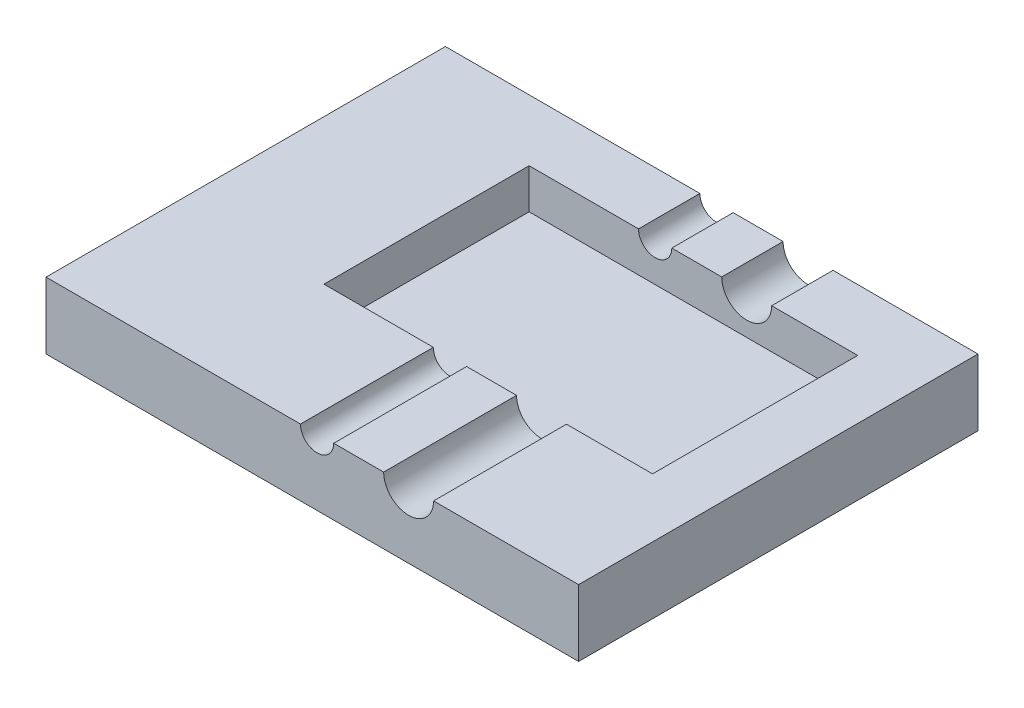
ISO-10303-21;
HEADER;
FILE_DESCRIPTION(('STEP AP214'),'2;1');
FILE_NAME('part.step','',(''),(''),'','','');
FILE_SCHEMA(('AUTOMOTIVE_DESIGN { 1 0 10303 214 1 1 1 1 }'));
ENDSEC;
DATA;
#1=APPLICATION_CONTEXT('core data for automotive mechanical design processes');
#2=APPLICATION_PROTOCOL_DEFINITION('international standard','automotive_design',2000,#1);
#3=PRODUCT_CONTEXT('',#1,'mechanical');
#4=PRODUCT('Part','Part','',(#3));
#5=PRODUCT_RELATED_PRODUCT_CATEGORY('part','',(#4));
#6=PRODUCT_DEFINITION_FORMATION('','',#4);
#7=PRODUCT_DEFINITION_CONTEXT('part definition',#1,'design');
#8=PRODUCT_DEFINITION('design','',#6,#7);
#9=PRODUCT_DEFINITION_SHAPE('','',#8);
#10=(LENGTH_UNIT() NAMED_UNIT(*) SI_UNIT(.MILLI.,.METRE.));
#11=(NAMED_UNIT(*) PLANE_ANGLE_UNIT() SI_UNIT($,.RADIAN.));
#12=(NAMED_UNIT(*) SI_UNIT($,.STERADIAN.) SOLID_ANGLE_UNIT());
#13=UNCERTAINTY_MEASURE_WITH_UNIT(LENGTH_MEASURE(1.E-05),#10,'distance_accuracy_value','');
#14=(GEOMETRIC_REPRESENTATION_CONTEXT(3) GLOBAL_UNCERTAINTY_ASSIGNED_CONTEXT((#13)) GLOBAL_UNIT_ASSIGNED_CONTEXT((#10,
#11,#12)) REPRESENTATION_CONTEXT('',''));
#15=CARTESIAN_POINT('',(0.,0.,0.));
#16=DIRECTION('',(0.,0.,1.));
#17=DIRECTION('',(1.,0.,0.));
#18=AXIS2_PLACEMENT_3D('',#15,#16,#17);
#19=CARTESIAN_POINT('',(0.,12.7,0.));
#20=DIRECTION('',(0.,-1.,0.));
#21=DIRECTION('',(0.,0.,-1.));
#22=AXIS2_PLACEMENT_3D('',#19,#20,#21);
#23=PLANE('',#22);
#24=DIRECTION('',(1.,0.,0.));
#25=VECTOR('',#24,1.);
#26=CARTESIAN_POINT('',(-23.1249939003562,12.7,-17.3143065832297));
#27=LINE('',#26,#25);
#28=CARTESIAN_POINT('',(4.09208018547385,12.7,-17.3143065832297));
#29=VERTEX_POINT('',#28);
#30=CARTESIAN_POINT('',(13.6170801854738,12.7,-17.3143065832297));
#31=VERTEX_POINT('',#30);
#32=EDGE_CURVE('E230',#29,#31,#27,.T.);
#33=ORIENTED_EDGE('',*,*,#32,.F.);
#34=DIRECTION('',(0.,0.,1.));
#35=VECTOR('',#34,1.);
#36=CARTESIAN_POINT('',(4.09208018547384,12.7,-68.1620253164557));
#37=LINE('',#36,#35);
#38=CARTESIAN_POINT('',(4.09208018547385,12.7,8.03797468354433));
#39=VERTEX_POINT('',#38);
#40=EDGE_CURVE('E257',#29,#39,#37,.T.);
#41=ORIENTED_EDGE('',*,*,#40,.T.);
#42=DIRECTION('',(1.,0.,0.));
#43=VECTOR('',#42,1.);
#44=CARTESIAN_POINT('',(-50.8,12.7,8.03797468354433));
#45=LINE('',#44,#43);
#46=CARTESIAN_POINT('',(13.6170801854738,12.7,8.03797468354433));
#47=VERTEX_POINT('',#46);
#48=EDGE_CURVE('E351',#39,#47,#45,.T.);
#49=ORIENTED_EDGE('',*,*,#48,.T.);
#50=DIRECTION('',(0.,0.,1.));
#51=VECTOR('',#50,1.);
#52=CARTESIAN_POINT('',(13.6170801854738,12.7,-68.1620253164557));
#53=LINE('',#52,#51);
#54=EDGE_CURVE('E271',#47,#31,#53,.F.);
#55=ORIENTED_EDGE('',*,*,#54,.T.);
#56=EDGE_LOOP('',(#33,#41,#49,#55));
#57=FACE_BOUND('',#56,.T.);
#58=ADVANCED_FACE('F44',(#57),#23,.F.);
#59=DIRECTION('',(-1.,0.,0.));
#60=VECTOR('',#59,1.);
#61=CARTESIAN_POINT('',(-50.8,12.7,-68.1620253164557));
#62=LINE('',#61,#60);
#63=CARTESIAN_POINT('',(13.6170801854738,12.7,-68.1620253164557));
#64=VERTEX_POINT('',#63);
#65=CARTESIAN_POINT('',(4.09208018547385,12.7,-68.1620253164557));
#66=VERTEX_POINT('',#65);
#67=EDGE_CURVE('E180',#64,#66,#62,.T.);
#68=ORIENTED_EDGE('',*,*,#67,.T.);
#69=CARTESIAN_POINT('',(4.09208018547385,12.7,-56.452963685655));
#70=VERTEX_POINT('',#69);
#71=EDGE_CURVE('E242',#66,#70,#37,.T.);
#72=ORIENTED_EDGE('',*,*,#71,.T.);
#73=DIRECTION('',(1.,0.,0.));
#74=VECTOR('',#73,1.);
#75=CARTESIAN_POINT('',(-23.1249939003562,12.7,-56.452963685655));
#76=LINE('',#75,#74);
#77=CARTESIAN_POINT('',(13.6170801854738,12.7,-56.452963685655));
#78=VERTEX_POINT('',#77);
#79=EDGE_CURVE('E240',#70,#78,#76,.T.);
#80=ORIENTED_EDGE('',*,*,#79,.T.);
#81=EDGE_CURVE('E61',#78,#64,#53,.F.);
#82=ORIENTED_EDGE('',*,*,#81,.T.);
#83=EDGE_LOOP('',(#68,#72,#80,#82));
#84=FACE_BOUND('',#83,.T.);
#85=ADVANCED_FACE('F283',(#84),#23,.F.);
#86=CARTESIAN_POINT('',(50.8,12.7,-68.1620253164557));
#87=VERTEX_POINT('',#86);
#88=CARTESIAN_POINT('',(23.1420801854738,12.7,-68.1620253164557));
#89=VERTEX_POINT('',#88);
#90=EDGE_CURVE('E173',#87,#89,#62,.T.);
#91=ORIENTED_EDGE('',*,*,#90,.T.);
#92=DIRECTION('',(0.,0.,1.));
#93=VECTOR('',#92,1.);
#94=CARTESIAN_POINT('',(23.1420801854738,12.7,-68.1620253164557));
#95=LINE('',#94,#93);
#96=CARTESIAN_POINT('',(23.1420801854738,12.7,-56.452963685655));
#97=VERTEX_POINT('',#96);
#98=EDGE_CURVE('E160',#89,#97,#95,.T.);
#99=ORIENTED_EDGE('',*,*,#98,.T.);
#100=CARTESIAN_POINT('',(39.5600692919533,12.7,-56.452963685655));
#101=VERTEX_POINT('',#100);
#102=EDGE_CURVE('E236',#97,#101,#76,.T.);
#103=ORIENTED_EDGE('',*,*,#102,.T.);
#104=DIRECTION('',(0.,0.,-1.));
#105=VECTOR('',#104,1.);
#106=CARTESIAN_POINT('',(39.5600692919533,12.7,-17.3143065832297));
#107=LINE('',#106,#105);
#108=CARTESIAN_POINT('',(39.5600692919533,12.7,-17.3143065832297));
#109=VERTEX_POINT('',#108);
#110=EDGE_CURVE('E228',#109,#101,#107,.T.);
#111=ORIENTED_EDGE('',*,*,#110,.F.);
#112=CARTESIAN_POINT('',(23.1420801854738,12.7,-17.3143065832297));
#113=VERTEX_POINT('',#112);
#114=EDGE_CURVE('E227',#113,#109,#27,.T.);
#115=ORIENTED_EDGE('',*,*,#114,.F.);
#116=CARTESIAN_POINT('',(23.1420801854738,12.7,8.03797468354433));
#117=VERTEX_POINT('',#116);
#118=EDGE_CURVE('E169',#113,#117,#95,.T.);
#119=ORIENTED_EDGE('',*,*,#118,.T.);
#120=CARTESIAN_POINT('',(50.8,12.7,8.03797468354433));
#121=VERTEX_POINT('',#120);
#122=EDGE_CURVE('E191',#117,#121,#45,.T.);
#123=ORIENTED_EDGE('',*,*,#122,.T.);
#124=DIRECTION('',(0.,0.,-1.));
#125=VECTOR('',#124,1.);
#126=CARTESIAN_POINT('',(50.8,12.7,8.03797468354433));
#127=LINE('',#126,#125);
#128=EDGE_CURVE('E184',#121,#87,#127,.T.);
#129=ORIENTED_EDGE('',*,*,#128,.T.);
#130=EDGE_LOOP('',(#91,#99,#103,#111,#115,#119,#123,#129));
#131=FACE_BOUND('',#130,.T.);
#132=ADVANCED_FACE('F185',(#131),#23,.F.);
#133=CARTESIAN_POINT('',(-50.8,12.7,8.03797468354433));
#134=DIRECTION('',(0.,0.,-1.));
#135=DIRECTION('',(-1.,0.,0.));
#136=AXIS2_PLACEMENT_3D('',#133,#134,#135);
#137=PLANE('',#136);
#138=CARTESIAN_POINT('',(0.917080185473845,12.7,8.03797468354433));
#139=DIRECTION('',(0.,0.,1.));
#140=DIRECTION('',(1.,0.,0.));
#141=AXIS2_PLACEMENT_3D('',#138,#139,#140);
#142=CIRCLE('',#141,3.175);
#143=CARTESIAN_POINT('',(-2.25791981452615,12.7,8.03797468354433));
#144=VERTEX_POINT('',#143);
#145=EDGE_CURVE('E279',#144,#39,#142,.T.);
#146=ORIENTED_EDGE('',*,*,#145,.F.);
#147=CARTESIAN_POINT('',(-50.8,12.7,8.03797468354433));
#148=VERTEX_POINT('',#147);
#149=EDGE_CURVE('E314',#148,#144,#45,.T.);
#150=ORIENTED_EDGE('',*,*,#149,.F.);
#151=DIRECTION('',(0.,-1.,0.));
#152=VECTOR('',#151,1.);
#153=CARTESIAN_POINT('',(-50.8,12.7,8.03797468354433));
#154=LINE('',#153,#152);
#155=CARTESIAN_POINT('',(-50.8,0.,8.03797468354433));
#156=VERTEX_POINT('',#155);
#157=EDGE_CURVE('E311',#148,#156,#154,.T.);
#158=ORIENTED_EDGE('',*,*,#157,.T.);
#159=DIRECTION('',(1.,0.,0.));
#160=VECTOR('',#159,1.);
#161=CARTESIAN_POINT('',(-50.8,0.,8.03797468354433));
#162=LINE('',#161,#160);
#163=CARTESIAN_POINT('',(50.8,0.,8.03797468354433));
#164=VERTEX_POINT('',#163);
#165=EDGE_CURVE('E200',#156,#164,#162,.T.);
#166=ORIENTED_EDGE('',*,*,#165,.T.);
#167=DIRECTION('',(0.,-1.,0.));
#168=VECTOR('',#167,1.);
#169=CARTESIAN_POINT('',(50.8,12.7,8.03797468354433));
#170=LINE('',#169,#168);
#171=EDGE_CURVE('E310',#121,#164,#170,.T.);
#172=ORIENTED_EDGE('',*,*,#171,.F.);
#173=ORIENTED_EDGE('',*,*,#122,.F.);
#174=CARTESIAN_POINT('',(18.3795801854738,12.7,8.03797468354433));
#175=DIRECTION('',(0.,0.,1.));
#176=DIRECTION('',(1.,0.,0.));
#177=AXIS2_PLACEMENT_3D('',#174,#175,#176);
#178=CIRCLE('',#177,4.7625);
#179=EDGE_CURVE('E177',#47,#117,#178,.T.);
#180=ORIENTED_EDGE('',*,*,#179,.F.);
#181=ORIENTED_EDGE('',*,*,#48,.F.);
#182=EDGE_LOOP('',(#146,#150,#158,#166,#172,#173,#180,#181));
#183=FACE_BOUND('',#182,.T.);
#184=ADVANCED_FACE('F359',(#183),#137,.F.);
#185=ORIENTED_EDGE('',*,*,#149,.T.);
#186=DIRECTION('',(0.,0.,1.));
#187=VECTOR('',#186,1.);
#188=CARTESIAN_POINT('',(-2.25791981452615,12.7,-68.1620253164557));
#189=LINE('',#188,#187);
#190=CARTESIAN_POINT('',(-2.25791981452615,12.7,-17.3143065832297));
#191=VERTEX_POINT('',#190);
#192=EDGE_CURVE('E167',#144,#191,#189,.F.);
#193=ORIENTED_EDGE('',*,*,#192,.T.);
#194=CARTESIAN_POINT('',(-23.1249939003562,12.7,-17.3143065832297));
#195=VERTEX_POINT('',#194);
#196=EDGE_CURVE('E225',#195,#191,#27,.T.);
#197=ORIENTED_EDGE('',*,*,#196,.F.);
#198=DIRECTION('',(0.,0.,-1.));
#199=VECTOR('',#198,1.);
#200=CARTESIAN_POINT('',(-23.1249939003562,12.7,-17.3143065832297));
#201=LINE('',#200,#199);
#202=CARTESIAN_POINT('',(-23.1249939003562,12.7,-56.452963685655));
#203=VERTEX_POINT('',#202);
#204=EDGE_CURVE('E239',#195,#203,#201,.T.);
#205=ORIENTED_EDGE('',*,*,#204,.T.);
#206=CARTESIAN_POINT('',(-2.25791981452615,12.7,-56.452963685655));
#207=VERTEX_POINT('',#206);
#208=EDGE_CURVE('E235',#203,#207,#76,.T.);
#209=ORIENTED_EDGE('',*,*,#208,.T.);
#210=CARTESIAN_POINT('',(-2.25791981452615,12.7,-68.1620253164557));
#211=VERTEX_POINT('',#210);
#212=EDGE_CURVE('E68',#207,#211,#189,.F.);
#213=ORIENTED_EDGE('',*,*,#212,.T.);
#214=CARTESIAN_POINT('',(-50.8,12.7,-68.1620253164557));
#215=VERTEX_POINT('',#214);
#216=EDGE_CURVE('E188',#211,#215,#62,.T.);
#217=ORIENTED_EDGE('',*,*,#216,.T.);
#218=DIRECTION('',(0.,0.,1.));
#219=VECTOR('',#218,1.);
#220=CARTESIAN_POINT('',(-50.8,12.7,8.03797468354433));
#221=LINE('',#220,#219);
#222=EDGE_CURVE('E190',#215,#148,#221,.T.);
#223=ORIENTED_EDGE('',*,*,#222,.T.);
#224=EDGE_LOOP('',(#185,#193,#197,#205,#209,#213,#217,#223));
#225=FACE_BOUND('',#224,.T.);
#226=ADVANCED_FACE('F347',(#225),#23,.F.);
#227=CARTESIAN_POINT('',(50.8,12.7,8.03797468354433));
#228=DIRECTION('',(-1.,0.,0.));
#229=DIRECTION('',(0.,0.,1.));
#230=AXIS2_PLACEMENT_3D('',#227,#228,#229);
#231=PLANE('',#230);
#232=DIRECTION('',(0.,0.,-1.));
#233=VECTOR('',#232,1.);
#234=CARTESIAN_POINT('',(50.8,0.,8.03797468354433));
#235=LINE('',#234,#233);
#236=CARTESIAN_POINT('',(50.8,0.,-68.1620253164557));
#237=VERTEX_POINT('',#236);
#238=EDGE_CURVE('E208',#164,#237,#235,.T.);
#239=ORIENTED_EDGE('',*,*,#238,.T.);
#240=DIRECTION('',(0.,-1.,0.));
#241=VECTOR('',#240,1.);
#242=CARTESIAN_POINT('',(50.8,12.7,-68.1620253164557));
#243=LINE('',#242,#241);
#244=EDGE_CURVE('E319',#87,#237,#243,.T.);
#245=ORIENTED_EDGE('',*,*,#244,.F.);
#246=ORIENTED_EDGE('',*,*,#128,.F.);
#247=ORIENTED_EDGE('',*,*,#171,.T.);
#248=EDGE_LOOP('',(#239,#245,#246,#247));
#249=FACE_BOUND('',#248,.T.);
#250=ADVANCED_FACE('F50',(#249),#231,.F.);
#251=CARTESIAN_POINT('',(-50.8,12.7,-68.1620253164557));
#252=DIRECTION('',(0.,0.,1.));
#253=DIRECTION('',(1.,0.,0.));
#254=AXIS2_PLACEMENT_3D('',#251,#252,#253);
#255=PLANE('',#254);
#256=ORIENTED_EDGE('',*,*,#216,.F.);
#257=CARTESIAN_POINT('',(0.917080185473845,12.7,-68.1620253164557));
#258=DIRECTION('',(0.,0.,1.));
#259=DIRECTION('',(1.,0.,0.));
#260=AXIS2_PLACEMENT_3D('',#257,#258,#259);
#261=CIRCLE('',#260,3.175);
#262=EDGE_CURVE('E273',#211,#66,#261,.T.);
#263=ORIENTED_EDGE('',*,*,#262,.T.);
#264=ORIENTED_EDGE('',*,*,#67,.F.);
#265=CARTESIAN_POINT('',(18.3795801854738,12.7,-68.1620253164557));
#266=DIRECTION('',(0.,0.,1.));
#267=DIRECTION('',(1.,0.,0.));
#268=AXIS2_PLACEMENT_3D('',#265,#266,#267);
#269=CIRCLE('',#268,4.7625);
#270=EDGE_CURVE('E159',#64,#89,#269,.T.);
#271=ORIENTED_EDGE('',*,*,#270,.T.);
#272=ORIENTED_EDGE('',*,*,#90,.F.);
#273=ORIENTED_EDGE('',*,*,#244,.T.);
#274=DIRECTION('',(-1.,0.,0.));
#275=VECTOR('',#274,1.);
#276=CARTESIAN_POINT('',(-50.8,0.,-68.1620253164557));
#277=LINE('',#276,#275);
#278=CARTESIAN_POINT('',(-50.8,0.,-68.1620253164557));
#279=VERTEX_POINT('',#278);
#280=EDGE_CURVE('E297',#237,#279,#277,.T.);
#281=ORIENTED_EDGE('',*,*,#280,.T.);
#282=DIRECTION('',(0.,-1.,0.));
#283=VECTOR('',#282,1.);
#284=CARTESIAN_POINT('',(-50.8,12.7,-68.1620253164557));
#285=LINE('',#284,#283);
#286=EDGE_CURVE('E320',#215,#279,#285,.T.);
#287=ORIENTED_EDGE('',*,*,#286,.F.);
#288=EDGE_LOOP('',(#256,#263,#264,#271,#272,#273,#281,#287));
#289=FACE_BOUND('',#288,.T.);
#290=ADVANCED_FACE('F175',(#289),#255,.F.);
#291=CARTESIAN_POINT('',(-50.8,12.7,8.03797468354433));
#292=DIRECTION('',(1.,0.,0.));
#293=DIRECTION('',(0.,0.,-1.));
#294=AXIS2_PLACEMENT_3D('',#291,#292,#293);
#295=PLANE('',#294);
#296=DIRECTION('',(0.,0.,1.));
#297=VECTOR('',#296,1.);
#298=CARTESIAN_POINT('',(-50.8,0.,8.03797468354433));
#299=LINE('',#298,#297);
#300=EDGE_CURVE('E203',#279,#156,#299,.T.);
#301=ORIENTED_EDGE('',*,*,#300,.T.);
#302=ORIENTED_EDGE('',*,*,#157,.F.);
#303=ORIENTED_EDGE('',*,*,#222,.F.);
#304=ORIENTED_EDGE('',*,*,#286,.T.);
#305=EDGE_LOOP('',(#301,#302,#303,#304));
#306=FACE_BOUND('',#305,.T.);
#307=ADVANCED_FACE('F453',(#306),#295,.F.);
#308=CARTESIAN_POINT('',(0.,0.,0.));
#309=DIRECTION('',(0.,-1.,0.));
#310=DIRECTION('',(0.,0.,-1.));
#311=AXIS2_PLACEMENT_3D('',#308,#309,#310);
#312=PLANE('',#311);
#313=ORIENTED_EDGE('',*,*,#238,.F.);
#314=ORIENTED_EDGE('',*,*,#165,.F.);
#315=ORIENTED_EDGE('',*,*,#300,.F.);
#316=ORIENTED_EDGE('',*,*,#280,.F.);
#317=EDGE_LOOP('',(#313,#314,#315,#316));
#318=FACE_BOUND('',#317,.T.);
#319=ADVANCED_FACE('F445',(#318),#312,.T.);
#320=CARTESIAN_POINT('',(-23.1249939003562,5.08,-17.3143065832297));
#321=DIRECTION('',(1.,0.,0.));
#322=DIRECTION('',(0.,0.,-1.));
#323=AXIS2_PLACEMENT_3D('',#320,#321,#322);
#324=PLANE('',#323);
#325=ORIENTED_EDGE('',*,*,#204,.F.);
#326=DIRECTION('',(0.,1.,0.));
#327=VECTOR('',#326,1.);
#328=CARTESIAN_POINT('',(-23.1249939003562,5.08,-17.3143065832297));
#329=LINE('',#328,#327);
#330=CARTESIAN_POINT('',(-23.1249939003562,5.08,-17.3143065832297));
#331=VERTEX_POINT('',#330);
#332=EDGE_CURVE('E220',#331,#195,#329,.T.);
#333=ORIENTED_EDGE('',*,*,#332,.F.);
#334=DIRECTION('',(0.,0.,-1.));
#335=VECTOR('',#334,1.);
#336=CARTESIAN_POINT('',(-23.1249939003562,5.08,-17.3143065832297));
#337=LINE('',#336,#335);
#338=CARTESIAN_POINT('',(-23.1249939003562,5.08,-56.452963685655));
#339=VERTEX_POINT('',#338);
#340=EDGE_CURVE('E226',#331,#339,#337,.T.);
#341=ORIENTED_EDGE('',*,*,#340,.T.);
#342=DIRECTION('',(0.,1.,0.));
#343=VECTOR('',#342,1.);
#344=CARTESIAN_POINT('',(-23.1249939003562,5.08,-56.452963685655));
#345=LINE('',#344,#343);
#346=EDGE_CURVE('E204',#339,#203,#345,.T.);
#347=ORIENTED_EDGE('',*,*,#346,.T.);
#348=EDGE_LOOP('',(#325,#333,#341,#347));
#349=FACE_BOUND('',#348,.T.);
#350=ADVANCED_FACE('F341',(#349),#324,.T.);
#351=CARTESIAN_POINT('',(-23.1249939003562,5.08,-56.452963685655));
#352=DIRECTION('',(0.,0.,1.));
#353=DIRECTION('',(1.,0.,0.));
#354=AXIS2_PLACEMENT_3D('',#351,#352,#353);
#355=PLANE('',#354);
#356=CARTESIAN_POINT('',(0.917080185473845,12.7,-56.452963685655));
#357=DIRECTION('',(0.,0.,1.));
#358=DIRECTION('',(1.,0.,0.));
#359=AXIS2_PLACEMENT_3D('',#356,#357,#358);
#360=CIRCLE('',#359,3.175);
#361=EDGE_CURVE('E260',#207,#70,#360,.T.);
#362=ORIENTED_EDGE('',*,*,#361,.F.);
#363=ORIENTED_EDGE('',*,*,#208,.F.);
#364=ORIENTED_EDGE('',*,*,#346,.F.);
#365=DIRECTION('',(1.,0.,0.));
#366=VECTOR('',#365,1.);
#367=CARTESIAN_POINT('',(-23.1249939003562,5.08,-56.452963685655));
#368=LINE('',#367,#366);
#369=CARTESIAN_POINT('',(39.5600692919533,5.08,-56.452963685655));
#370=VERTEX_POINT('',#369);
#371=EDGE_CURVE('E253',#339,#370,#368,.T.);
#372=ORIENTED_EDGE('',*,*,#371,.T.);
#373=DIRECTION('',(0.,1.,0.));
#374=VECTOR('',#373,1.);
#375=CARTESIAN_POINT('',(39.5600692919533,5.08,-56.452963685655));
#376=LINE('',#375,#374);
#377=EDGE_CURVE('E207',#370,#101,#376,.T.);
#378=ORIENTED_EDGE('',*,*,#377,.T.);
#379=ORIENTED_EDGE('',*,*,#102,.F.);
#380=CARTESIAN_POINT('',(18.3795801854738,12.7,-56.452963685655));
#381=DIRECTION('',(0.,0.,1.));
#382=DIRECTION('',(1.,0.,0.));
#383=AXIS2_PLACEMENT_3D('',#380,#381,#382);
#384=CIRCLE('',#383,4.7625);
#385=EDGE_CURVE('E161',#78,#97,#384,.T.);
#386=ORIENTED_EDGE('',*,*,#385,.F.);
#387=ORIENTED_EDGE('',*,*,#79,.F.);
#388=EDGE_LOOP('',(#362,#363,#364,#372,#378,#379,#386,#387));
#389=FACE_BOUND('',#388,.T.);
#390=ADVANCED_FACE('F343',(#389),#355,.T.);
#391=CARTESIAN_POINT('',(39.5600692919533,5.08,-17.3143065832297));
#392=DIRECTION('',(1.,0.,0.));
#393=DIRECTION('',(0.,0.,-1.));
#394=AXIS2_PLACEMENT_3D('',#391,#392,#393);
#395=PLANE('',#394);
#396=ORIENTED_EDGE('',*,*,#110,.T.);
#397=ORIENTED_EDGE('',*,*,#377,.F.);
#398=DIRECTION('',(0.,0.,-1.));
#399=VECTOR('',#398,1.);
#400=CARTESIAN_POINT('',(39.5600692919533,5.08,-17.3143065832297));
#401=LINE('',#400,#399);
#402=CARTESIAN_POINT('',(39.5600692919533,5.08,-17.3143065832297));
#403=VERTEX_POINT('',#402);
#404=EDGE_CURVE('E246',#403,#370,#401,.T.);
#405=ORIENTED_EDGE('',*,*,#404,.F.);
#406=DIRECTION('',(0.,1.,0.));
#407=VECTOR('',#406,1.);
#408=CARTESIAN_POINT('',(39.5600692919533,5.08,-17.3143065832297));
#409=LINE('',#408,#407);
#410=EDGE_CURVE('E213',#403,#109,#409,.T.);
#411=ORIENTED_EDGE('',*,*,#410,.T.);
#412=EDGE_LOOP('',(#396,#397,#405,#411));
#413=FACE_BOUND('',#412,.T.);
#414=ADVANCED_FACE('F334',(#413),#395,.F.);
#415=CARTESIAN_POINT('',(-23.1249939003562,5.08,-17.3143065832297));
#416=DIRECTION('',(0.,0.,1.));
#417=DIRECTION('',(1.,0.,0.));
#418=AXIS2_PLACEMENT_3D('',#415,#416,#417);
#419=PLANE('',#418);
#420=ORIENTED_EDGE('',*,*,#196,.T.);
#421=CARTESIAN_POINT('',(0.917080185473845,12.7,-17.3143065832297));
#422=DIRECTION('',(0.,0.,1.));
#423=DIRECTION('',(1.,0.,0.));
#424=AXIS2_PLACEMENT_3D('',#421,#422,#423);
#425=CIRCLE('',#424,3.175);
#426=EDGE_CURVE('E11',#191,#29,#425,.T.);
#427=ORIENTED_EDGE('',*,*,#426,.T.);
#428=ORIENTED_EDGE('',*,*,#32,.T.);
#429=CARTESIAN_POINT('',(18.3795801854738,12.7,-17.3143065832297));
#430=DIRECTION('',(0.,0.,1.));
#431=DIRECTION('',(1.,0.,0.));
#432=AXIS2_PLACEMENT_3D('',#429,#430,#431);
#433=CIRCLE('',#432,4.7625);
#434=EDGE_CURVE('E53',#31,#113,#433,.T.);
#435=ORIENTED_EDGE('',*,*,#434,.T.);
#436=ORIENTED_EDGE('',*,*,#114,.T.);
#437=ORIENTED_EDGE('',*,*,#410,.F.);
#438=DIRECTION('',(1.,0.,0.));
#439=VECTOR('',#438,1.);
#440=CARTESIAN_POINT('',(-23.1249939003562,5.08,-17.3143065832297));
#441=LINE('',#440,#439);
#442=EDGE_CURVE('E222',#331,#403,#441,.T.);
#443=ORIENTED_EDGE('',*,*,#442,.F.);
#444=ORIENTED_EDGE('',*,*,#332,.T.);
#445=EDGE_LOOP('',(#420,#427,#428,#435,#436,#437,#443,#444));
#446=FACE_BOUND('',#445,.T.);
#447=ADVANCED_FACE('F326',(#446),#419,.F.);
#448=CARTESIAN_POINT('',(0.,5.08,0.));
#449=DIRECTION('',(0.,-1.,0.));
#450=DIRECTION('',(0.,0.,-1.));
#451=AXIS2_PLACEMENT_3D('',#448,#449,#450);
#452=PLANE('',#451);
#453=ORIENTED_EDGE('',*,*,#340,.F.);
#454=ORIENTED_EDGE('',*,*,#442,.T.);
#455=ORIENTED_EDGE('',*,*,#404,.T.);
#456=ORIENTED_EDGE('',*,*,#371,.F.);
#457=EDGE_LOOP('',(#453,#454,#455,#456));
#458=FACE_BOUND('',#457,.T.);
#459=ADVANCED_FACE('F338',(#458),#452,.F.);
#460=CARTESIAN_POINT('',(18.3795801854738,12.7,-68.1620253164557));
#461=DIRECTION('',(0.,0.,1.));
#462=DIRECTION('',(1.,0.,0.));
#463=AXIS2_PLACEMENT_3D('',#460,#461,#462);
#464=CYLINDRICAL_SURFACE('',#463,4.7625);
#465=ORIENTED_EDGE('',*,*,#434,.F.);
#466=ORIENTED_EDGE('',*,*,#54,.F.);
#467=ORIENTED_EDGE('',*,*,#179,.T.);
#468=ORIENTED_EDGE('',*,*,#118,.F.);
#469=EDGE_LOOP('',(#465,#466,#467,#468));
#470=FACE_BOUND('',#469,.T.);
#471=ADVANCED_FACE('F352',(#470),#464,.F.);
#472=CARTESIAN_POINT('',(0.917080185473845,12.7,-68.1620253164557));
#473=DIRECTION('',(0.,0.,1.));
#474=DIRECTION('',(1.,0.,0.));
#475=AXIS2_PLACEMENT_3D('',#472,#473,#474);
#476=CYLINDRICAL_SURFACE('',#475,3.175);
#477=ORIENTED_EDGE('',*,*,#426,.F.);
#478=ORIENTED_EDGE('',*,*,#192,.F.);
#479=ORIENTED_EDGE('',*,*,#145,.T.);
#480=ORIENTED_EDGE('',*,*,#40,.F.);
#481=EDGE_LOOP('',(#477,#478,#479,#480));
#482=FACE_BOUND('',#481,.T.);
#483=ADVANCED_FACE('F364',(#482),#476,.F.);
#484=ORIENTED_EDGE('',*,*,#270,.F.);
#485=ORIENTED_EDGE('',*,*,#81,.F.);
#486=ORIENTED_EDGE('',*,*,#385,.T.);
#487=ORIENTED_EDGE('',*,*,#98,.F.);
#488=EDGE_LOOP('',(#484,#485,#486,#487));
#489=FACE_BOUND('',#488,.T.);
#490=ADVANCED_FACE('F157',(#489),#464,.F.);
#491=ORIENTED_EDGE('',*,*,#262,.F.);
#492=ORIENTED_EDGE('',*,*,#212,.F.);
#493=ORIENTED_EDGE('',*,*,#361,.T.);
#494=ORIENTED_EDGE('',*,*,#71,.F.);
#495=EDGE_LOOP('',(#491,#492,#493,#494));
#496=FACE_BOUND('',#495,.T.);
#497=ADVANCED_FACE('F366',(#496),#476,.F.);
#498=CLOSED_SHELL('',(#58,#85,#132,#184,#226,#250,#290,#307,#319,#350,#390,#414,#447,#459,#471,
#483,#490,#497));
#499=MANIFOLD_SOLID_BREP('B2',#498);
#500=ADVANCED_BREP_SHAPE_REPRESENTATION('',(#18,#499),#14);
#501=SHAPE_DEFINITION_REPRESENTATION(#9,#500);
ENDSEC;
END-ISO-10303-21;
